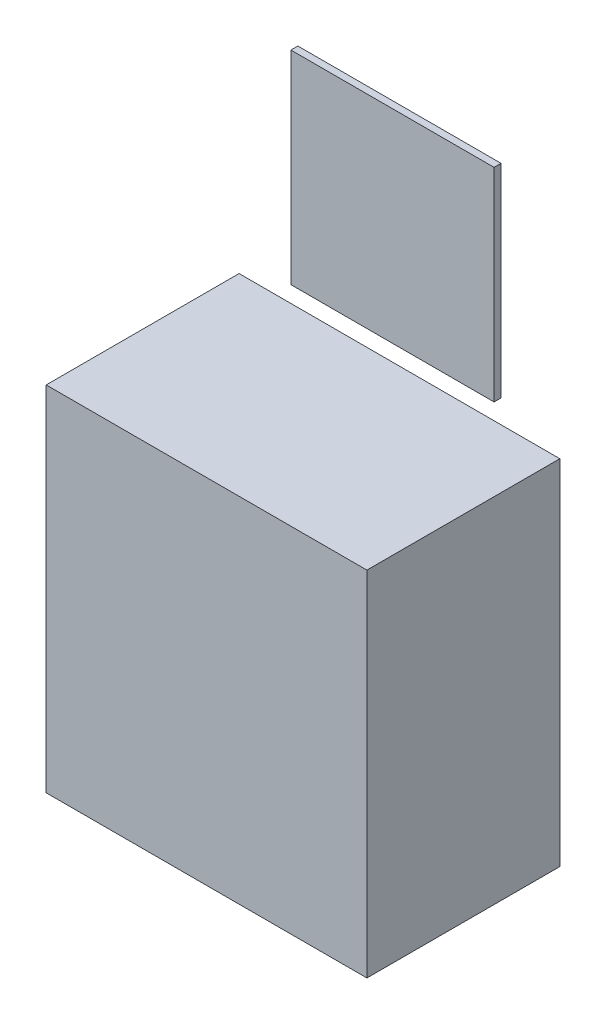
ISO-10303-21;
HEADER;
FILE_DESCRIPTION(('STEP AP214'),'2;1');
FILE_NAME('part.step','',(''),(''),'','','');
FILE_SCHEMA(('AUTOMOTIVE_DESIGN { 1 0 10303 214 1 1 1 1 }'));
ENDSEC;
DATA;
#1=APPLICATION_CONTEXT('core data for automotive mechanical design processes');
#2=APPLICATION_PROTOCOL_DEFINITION('international standard','automotive_design',2000,#1);
#3=PRODUCT_CONTEXT('',#1,'mechanical');
#4=PRODUCT('Part','Part','',(#3));
#5=PRODUCT_RELATED_PRODUCT_CATEGORY('part','',(#4));
#6=PRODUCT_DEFINITION_FORMATION('','',#4);
#7=PRODUCT_DEFINITION_CONTEXT('part definition',#1,'design');
#8=PRODUCT_DEFINITION('design','',#6,#7);
#9=PRODUCT_DEFINITION_SHAPE('','',#8);
#10=(LENGTH_UNIT() NAMED_UNIT(*) SI_UNIT(.MILLI.,.METRE.));
#11=(NAMED_UNIT(*) PLANE_ANGLE_UNIT() SI_UNIT($,.RADIAN.));
#12=(NAMED_UNIT(*) SI_UNIT($,.STERADIAN.) SOLID_ANGLE_UNIT());
#13=UNCERTAINTY_MEASURE_WITH_UNIT(LENGTH_MEASURE(1.E-05),#10,'distance_accuracy_value','');
#14=(GEOMETRIC_REPRESENTATION_CONTEXT(3) GLOBAL_UNCERTAINTY_ASSIGNED_CONTEXT((#13)) GLOBAL_UNIT_ASSIGNED_CONTEXT((#10,
#11,#12)) REPRESENTATION_CONTEXT('',''));
#15=CARTESIAN_POINT('',(0.,0.,0.));
#16=DIRECTION('',(0.,0.,1.));
#17=DIRECTION('',(1.,0.,0.));
#18=AXIS2_PLACEMENT_3D('',#15,#16,#17);
#19=CARTESIAN_POINT('',(-413.88930786391,882.440801129921,30.));
#20=DIRECTION('',(0.,1.,0.));
#21=DIRECTION('',(0.,0.,1.));
#22=AXIS2_PLACEMENT_3D('',#19,#20,#21);
#23=PLANE('',#22);
#24=DIRECTION('',(1.,0.,0.));
#25=VECTOR('',#24,1.);
#26=CARTESIAN_POINT('',(-413.88930786391,882.440801129921,0.));
#27=LINE('',#26,#25);
#28=CARTESIAN_POINT('',(-413.88930786391,882.440801129921,0.));
#29=VERTEX_POINT('',#28);
#30=CARTESIAN_POINT('',(460.414421911961,882.440801129921,0.));
#31=VERTEX_POINT('',#30);
#32=EDGE_CURVE('E115',#29,#31,#27,.T.);
#33=ORIENTED_EDGE('',*,*,#32,.T.);
#34=DIRECTION('',(0.,0.,-1.));
#35=VECTOR('',#34,1.);
#36=CARTESIAN_POINT('',(460.414421911961,882.440801129921,30.));
#37=LINE('',#36,#35);
#38=CARTESIAN_POINT('',(460.414421911961,882.440801129921,30.));
#39=VERTEX_POINT('',#38);
#40=EDGE_CURVE('E12',#39,#31,#37,.T.);
#41=ORIENTED_EDGE('',*,*,#40,.F.);
#42=DIRECTION('',(1.,0.,0.));
#43=VECTOR('',#42,1.);
#44=CARTESIAN_POINT('',(-413.88930786391,882.440801129921,30.));
#45=LINE('',#44,#43);
#46=CARTESIAN_POINT('',(-413.88930786391,882.440801129921,30.));
#47=VERTEX_POINT('',#46);
#48=EDGE_CURVE('E101',#47,#39,#45,.T.);
#49=ORIENTED_EDGE('',*,*,#48,.F.);
#50=DIRECTION('',(0.,0.,-1.));
#51=VECTOR('',#50,1.);
#52=CARTESIAN_POINT('',(-413.88930786391,882.440801129921,30.));
#53=LINE('',#52,#51);
#54=EDGE_CURVE('E68',#47,#29,#53,.T.);
#55=ORIENTED_EDGE('',*,*,#54,.T.);
#56=EDGE_LOOP('',(#33,#41,#49,#55));
#57=FACE_BOUND('',#56,.T.);
#58=ADVANCED_FACE('F52',(#57),#23,.F.);
#59=CARTESIAN_POINT('',(460.414421911961,882.440801129921,30.));
#60=DIRECTION('',(-1.,0.,0.));
#61=DIRECTION('',(0.,-1.,0.));
#62=AXIS2_PLACEMENT_3D('',#59,#60,#61);
#63=PLANE('',#62);
#64=DIRECTION('',(0.,1.,0.));
#65=VECTOR('',#64,1.);
#66=CARTESIAN_POINT('',(460.414421911961,882.440801129921,0.));
#67=LINE('',#66,#65);
#68=CARTESIAN_POINT('',(460.414421911961,1756.73580112992,0.));
#69=VERTEX_POINT('',#68);
#70=EDGE_CURVE('E106',#31,#69,#67,.T.);
#71=ORIENTED_EDGE('',*,*,#70,.T.);
#72=DIRECTION('',(0.,0.,-1.));
#73=VECTOR('',#72,1.);
#74=CARTESIAN_POINT('',(460.414421911961,1756.73580112992,30.));
#75=LINE('',#74,#73);
#76=CARTESIAN_POINT('',(460.414421911961,1756.73580112992,30.));
#77=VERTEX_POINT('',#76);
#78=EDGE_CURVE('E60',#77,#69,#75,.T.);
#79=ORIENTED_EDGE('',*,*,#78,.F.);
#80=DIRECTION('',(0.,1.,0.));
#81=VECTOR('',#80,1.);
#82=CARTESIAN_POINT('',(460.414421911961,882.440801129921,30.));
#83=LINE('',#82,#81);
#84=EDGE_CURVE('E93',#39,#77,#83,.T.);
#85=ORIENTED_EDGE('',*,*,#84,.F.);
#86=ORIENTED_EDGE('',*,*,#40,.T.);
#87=EDGE_LOOP('',(#71,#79,#85,#86));
#88=FACE_BOUND('',#87,.T.);
#89=ADVANCED_FACE('F105',(#88),#63,.F.);
#90=CARTESIAN_POINT('',(-413.88930786391,1756.73580112992,30.));
#91=DIRECTION('',(0.,1.,0.));
#92=DIRECTION('',(0.,0.,1.));
#93=AXIS2_PLACEMENT_3D('',#90,#91,#92);
#94=PLANE('',#93);
#95=DIRECTION('',(1.,0.,0.));
#96=VECTOR('',#95,1.);
#97=CARTESIAN_POINT('',(-413.88930786391,1756.73580112992,0.));
#98=LINE('',#97,#96);
#99=CARTESIAN_POINT('',(-413.88930786391,1756.73580112992,0.));
#100=VERTEX_POINT('',#99);
#101=EDGE_CURVE('E118',#100,#69,#98,.T.);
#102=ORIENTED_EDGE('',*,*,#101,.F.);
#103=DIRECTION('',(0.,0.,-1.));
#104=VECTOR('',#103,1.);
#105=CARTESIAN_POINT('',(-413.88930786391,1756.73580112992,30.));
#106=LINE('',#105,#104);
#107=CARTESIAN_POINT('',(-413.88930786391,1756.73580112992,30.));
#108=VERTEX_POINT('',#107);
#109=EDGE_CURVE('E82',#108,#100,#106,.T.);
#110=ORIENTED_EDGE('',*,*,#109,.F.);
#111=DIRECTION('',(1.,0.,0.));
#112=VECTOR('',#111,1.);
#113=CARTESIAN_POINT('',(-413.88930786391,1756.73580112992,30.));
#114=LINE('',#113,#112);
#115=EDGE_CURVE('E100',#108,#77,#114,.T.);
#116=ORIENTED_EDGE('',*,*,#115,.T.);
#117=ORIENTED_EDGE('',*,*,#78,.T.);
#118=EDGE_LOOP('',(#102,#110,#116,#117));
#119=FACE_BOUND('',#118,.T.);
#120=ADVANCED_FACE('F109',(#119),#94,.T.);
#121=CARTESIAN_POINT('',(-413.88930786391,882.440801129921,30.));
#122=DIRECTION('',(-1.,0.,0.));
#123=DIRECTION('',(0.,0.,1.));
#124=AXIS2_PLACEMENT_3D('',#121,#122,#123);
#125=PLANE('',#124);
#126=DIRECTION('',(0.,1.,0.));
#127=VECTOR('',#126,1.);
#128=CARTESIAN_POINT('',(-413.88930786391,882.440801129921,0.));
#129=LINE('',#128,#127);
#130=EDGE_CURVE('E120',#29,#100,#129,.T.);
#131=ORIENTED_EDGE('',*,*,#130,.F.);
#132=ORIENTED_EDGE('',*,*,#54,.F.);
#133=DIRECTION('',(0.,1.,0.));
#134=VECTOR('',#133,1.);
#135=CARTESIAN_POINT('',(-413.88930786391,882.440801129921,30.));
#136=LINE('',#135,#134);
#137=EDGE_CURVE('E110',#47,#108,#136,.T.);
#138=ORIENTED_EDGE('',*,*,#137,.T.);
#139=ORIENTED_EDGE('',*,*,#109,.T.);
#140=EDGE_LOOP('',(#131,#132,#138,#139));
#141=FACE_BOUND('',#140,.T.);
#142=ADVANCED_FACE('F126',(#141),#125,.T.);
#143=CARTESIAN_POINT('',(0.,0.,30.));
#144=DIRECTION('',(0.,0.,1.));
#145=DIRECTION('',(1.,0.,0.));
#146=AXIS2_PLACEMENT_3D('',#143,#144,#145);
#147=PLANE('',#146);
#148=ORIENTED_EDGE('',*,*,#48,.T.);
#149=ORIENTED_EDGE('',*,*,#84,.T.);
#150=ORIENTED_EDGE('',*,*,#115,.F.);
#151=ORIENTED_EDGE('',*,*,#137,.F.);
#152=EDGE_LOOP('',(#148,#149,#150,#151));
#153=FACE_BOUND('',#152,.T.);
#154=ADVANCED_FACE('F97',(#153),#147,.T.);
#155=CARTESIAN_POINT('',(0.,0.,0.));
#156=DIRECTION('',(0.,0.,1.));
#157=DIRECTION('',(1.,0.,0.));
#158=AXIS2_PLACEMENT_3D('',#155,#156,#157);
#159=PLANE('',#158);
#160=ORIENTED_EDGE('',*,*,#32,.F.);
#161=ORIENTED_EDGE('',*,*,#130,.T.);
#162=ORIENTED_EDGE('',*,*,#101,.T.);
#163=ORIENTED_EDGE('',*,*,#70,.F.);
#164=EDGE_LOOP('',(#160,#161,#162,#163));
#165=FACE_BOUND('',#164,.T.);
#166=ADVANCED_FACE('F125',(#165),#159,.F.);
#167=CLOSED_SHELL('',(#58,#89,#120,#142,#154,#166));
#168=MANIFOLD_SOLID_BREP('B2',#167);
#169=CARTESIAN_POINT('',(-666.737442975974,782.440801129921,830.));
#170=DIRECTION('',(0.,1.,0.));
#171=DIRECTION('',(-1.,0.,0.));
#172=AXIS2_PLACEMENT_3D('',#169,#170,#171);
#173=PLANE('',#172);
#174=DIRECTION('',(1.,0.,0.));
#175=VECTOR('',#174,1.);
#176=CARTESIAN_POINT('',(-666.737442975974,782.440801129921,0.));
#177=LINE('',#176,#175);
#178=CARTESIAN_POINT('',(-666.737442975974,782.440801129921,0.));
#179=VERTEX_POINT('',#178);
#180=CARTESIAN_POINT('',(713.262557024026,782.440801129921,0.));
#181=VERTEX_POINT('',#180);
#182=EDGE_CURVE('E258',#179,#181,#177,.T.);
#183=ORIENTED_EDGE('',*,*,#182,.F.);
#184=DIRECTION('',(0.,0.,-1.));
#185=VECTOR('',#184,1.);
#186=CARTESIAN_POINT('',(-666.737442975974,782.440801129921,830.));
#187=LINE('',#186,#185);
#188=CARTESIAN_POINT('',(-666.737442975974,782.440801129921,830.));
#189=VERTEX_POINT('',#188);
#190=EDGE_CURVE('E50',#189,#179,#187,.T.);
#191=ORIENTED_EDGE('',*,*,#190,.F.);
#192=DIRECTION('',(1.,0.,0.));
#193=VECTOR('',#192,1.);
#194=CARTESIAN_POINT('',(-666.737442975974,782.440801129921,830.));
#195=LINE('',#194,#193);
#196=CARTESIAN_POINT('',(713.262557024026,782.440801129921,830.));
#197=VERTEX_POINT('',#196);
#198=EDGE_CURVE('E251',#189,#197,#195,.T.);
#199=ORIENTED_EDGE('',*,*,#198,.T.);
#200=DIRECTION('',(0.,0.,-1.));
#201=VECTOR('',#200,1.);
#202=CARTESIAN_POINT('',(713.262557024026,782.440801129921,830.));
#203=LINE('',#202,#201);
#204=EDGE_CURVE('E190',#197,#181,#203,.T.);
#205=ORIENTED_EDGE('',*,*,#204,.T.);
#206=EDGE_LOOP('',(#183,#191,#199,#205));
#207=FACE_BOUND('',#206,.T.);
#208=ADVANCED_FACE('F187',(#207),#173,.T.);
#209=CARTESIAN_POINT('',(-666.737442975974,782.440801129921,830.));
#210=DIRECTION('',(1.,0.,0.));
#211=DIRECTION('',(0.,1.,0.));
#212=AXIS2_PLACEMENT_3D('',#209,#210,#211);
#213=PLANE('',#212);
#214=DIRECTION('',(0.,-1.,0.));
#215=VECTOR('',#214,1.);
#216=CARTESIAN_POINT('',(-666.737442975974,782.440801129921,0.));
#217=LINE('',#216,#215);
#218=CARTESIAN_POINT('',(-666.737442975974,-737.559198870079,0.));
#219=VERTEX_POINT('',#218);
#220=EDGE_CURVE('E221',#179,#219,#217,.T.);
#221=ORIENTED_EDGE('',*,*,#220,.T.);
#222=DIRECTION('',(0.,0.,-1.));
#223=VECTOR('',#222,1.);
#224=CARTESIAN_POINT('',(-666.737442975974,-737.559198870079,830.));
#225=LINE('',#224,#223);
#226=CARTESIAN_POINT('',(-666.737442975974,-737.559198870079,830.));
#227=VERTEX_POINT('',#226);
#228=EDGE_CURVE('E197',#227,#219,#225,.T.);
#229=ORIENTED_EDGE('',*,*,#228,.F.);
#230=DIRECTION('',(0.,-1.,0.));
#231=VECTOR('',#230,1.);
#232=CARTESIAN_POINT('',(-666.737442975974,782.440801129921,830.));
#233=LINE('',#232,#231);
#234=EDGE_CURVE('E238',#189,#227,#233,.T.);
#235=ORIENTED_EDGE('',*,*,#234,.F.);
#236=ORIENTED_EDGE('',*,*,#190,.T.);
#237=EDGE_LOOP('',(#221,#229,#235,#236));
#238=FACE_BOUND('',#237,.T.);
#239=ADVANCED_FACE('F274',(#238),#213,.F.);
#240=CARTESIAN_POINT('',(-666.737442975974,-737.559198870079,830.));
#241=DIRECTION('',(0.,1.,0.));
#242=DIRECTION('',(0.,0.,1.));
#243=AXIS2_PLACEMENT_3D('',#240,#241,#242);
#244=PLANE('',#243);
#245=DIRECTION('',(1.,0.,0.));
#246=VECTOR('',#245,1.);
#247=CARTESIAN_POINT('',(-666.737442975974,-737.559198870079,0.));
#248=LINE('',#247,#246);
#249=CARTESIAN_POINT('',(713.262557024026,-737.559198870079,0.));
#250=VERTEX_POINT('',#249);
#251=EDGE_CURVE('E246',#219,#250,#248,.T.);
#252=ORIENTED_EDGE('',*,*,#251,.T.);
#253=DIRECTION('',(0.,0.,-1.));
#254=VECTOR('',#253,1.);
#255=CARTESIAN_POINT('',(713.262557024026,-737.559198870079,830.));
#256=LINE('',#255,#254);
#257=CARTESIAN_POINT('',(713.262557024026,-737.559198870079,830.));
#258=VERTEX_POINT('',#257);
#259=EDGE_CURVE('E243',#258,#250,#256,.T.);
#260=ORIENTED_EDGE('',*,*,#259,.F.);
#261=DIRECTION('',(1.,0.,0.));
#262=VECTOR('',#261,1.);
#263=CARTESIAN_POINT('',(-666.737442975974,-737.559198870079,830.));
#264=LINE('',#263,#262);
#265=EDGE_CURVE('E233',#227,#258,#264,.T.);
#266=ORIENTED_EDGE('',*,*,#265,.F.);
#267=ORIENTED_EDGE('',*,*,#228,.T.);
#268=EDGE_LOOP('',(#252,#260,#266,#267));
#269=FACE_BOUND('',#268,.T.);
#270=ADVANCED_FACE('F244',(#269),#244,.F.);
#271=CARTESIAN_POINT('',(713.262557024026,782.440801129921,830.));
#272=DIRECTION('',(1.,0.,0.));
#273=DIRECTION('',(0.,1.,0.));
#274=AXIS2_PLACEMENT_3D('',#271,#272,#273);
#275=PLANE('',#274);
#276=DIRECTION('',(0.,-1.,0.));
#277=VECTOR('',#276,1.);
#278=CARTESIAN_POINT('',(713.262557024026,782.440801129921,0.));
#279=LINE('',#278,#277);
#280=EDGE_CURVE('E262',#181,#250,#279,.T.);
#281=ORIENTED_EDGE('',*,*,#280,.F.);
#282=ORIENTED_EDGE('',*,*,#204,.F.);
#283=DIRECTION('',(0.,-1.,0.));
#284=VECTOR('',#283,1.);
#285=CARTESIAN_POINT('',(713.262557024026,782.440801129921,830.));
#286=LINE('',#285,#284);
#287=EDGE_CURVE('E237',#197,#258,#286,.T.);
#288=ORIENTED_EDGE('',*,*,#287,.T.);
#289=ORIENTED_EDGE('',*,*,#259,.T.);
#290=EDGE_LOOP('',(#281,#282,#288,#289));
#291=FACE_BOUND('',#290,.T.);
#292=ADVANCED_FACE('F249',(#291),#275,.T.);
#293=CARTESIAN_POINT('',(0.,0.,830.));
#294=DIRECTION('',(0.,0.,-1.));
#295=DIRECTION('',(-1.,0.,0.));
#296=AXIS2_PLACEMENT_3D('',#293,#294,#295);
#297=PLANE('',#296);
#298=ORIENTED_EDGE('',*,*,#198,.F.);
#299=ORIENTED_EDGE('',*,*,#234,.T.);
#300=ORIENTED_EDGE('',*,*,#265,.T.);
#301=ORIENTED_EDGE('',*,*,#287,.F.);
#302=EDGE_LOOP('',(#298,#299,#300,#301));
#303=FACE_BOUND('',#302,.T.);
#304=ADVANCED_FACE('F236',(#303),#297,.F.);
#305=CARTESIAN_POINT('',(0.,0.,0.));
#306=DIRECTION('',(0.,0.,-1.));
#307=DIRECTION('',(-1.,0.,0.));
#308=AXIS2_PLACEMENT_3D('',#305,#306,#307);
#309=PLANE('',#308);
#310=ORIENTED_EDGE('',*,*,#182,.T.);
#311=ORIENTED_EDGE('',*,*,#280,.T.);
#312=ORIENTED_EDGE('',*,*,#251,.F.);
#313=ORIENTED_EDGE('',*,*,#220,.F.);
#314=EDGE_LOOP('',(#310,#311,#312,#313));
#315=FACE_BOUND('',#314,.T.);
#316=ADVANCED_FACE('F271',(#315),#309,.T.);
#317=CLOSED_SHELL('',(#208,#239,#270,#292,#304,#316));
#318=MANIFOLD_SOLID_BREP('B6',#317);
#319=ADVANCED_BREP_SHAPE_REPRESENTATION('',(#18,#168,#318),#14);
#320=SHAPE_DEFINITION_REPRESENTATION(#9,#319);
ENDSEC;
END-ISO-10303-21;
